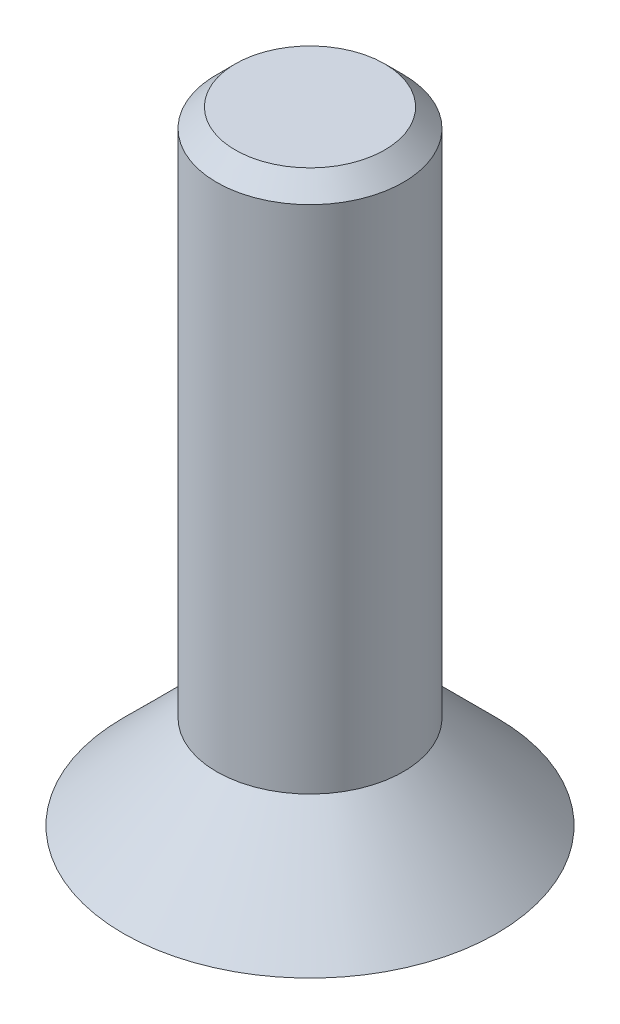
ISO-10303-21;
HEADER;
FILE_DESCRIPTION(('STEP AP214'),'2;1');
FILE_NAME('part.step','',(''),(''),'','','');
FILE_SCHEMA(('AUTOMOTIVE_DESIGN { 1 0 10303 214 1 1 1 1 }'));
ENDSEC;
DATA;
#1=APPLICATION_CONTEXT('core data for automotive mechanical design processes');
#2=APPLICATION_PROTOCOL_DEFINITION('international standard','automotive_design',2000,#1);
#3=PRODUCT_CONTEXT('',#1,'mechanical');
#4=PRODUCT('Part','Part','',(#3));
#5=PRODUCT_RELATED_PRODUCT_CATEGORY('part','',(#4));
#6=PRODUCT_DEFINITION_FORMATION('','',#4);
#7=PRODUCT_DEFINITION_CONTEXT('part definition',#1,'design');
#8=PRODUCT_DEFINITION('design','',#6,#7);
#9=PRODUCT_DEFINITION_SHAPE('','',#8);
#10=(LENGTH_UNIT() NAMED_UNIT(*) SI_UNIT(.MILLI.,.METRE.));
#11=(NAMED_UNIT(*) PLANE_ANGLE_UNIT() SI_UNIT($,.RADIAN.));
#12=(NAMED_UNIT(*) SI_UNIT($,.STERADIAN.) SOLID_ANGLE_UNIT());
#13=UNCERTAINTY_MEASURE_WITH_UNIT(LENGTH_MEASURE(1.E-05),#10,'distance_accuracy_value','');
#14=(GEOMETRIC_REPRESENTATION_CONTEXT(3) GLOBAL_UNCERTAINTY_ASSIGNED_CONTEXT((#13)) GLOBAL_UNIT_ASSIGNED_CONTEXT((#10,
#11,#12)) REPRESENTATION_CONTEXT('',''));
#15=CARTESIAN_POINT('',(0.,0.,0.));
#16=DIRECTION('',(0.,0.,1.));
#17=DIRECTION('',(1.,0.,0.));
#18=AXIS2_PLACEMENT_3D('',#15,#16,#17);
#19=CARTESIAN_POINT('',(0.,0.,0.));
#20=DIRECTION('',(0.,-1.,0.));
#21=DIRECTION('',(0.,0.,-1.));
#22=AXIS2_PLACEMENT_3D('',#19,#20,#21);
#23=PLANE('',#22);
#24=DIRECTION('',(0.5,0.,0.866025403784439));
#25=VECTOR('',#24,1.);
#26=CARTESIAN_POINT('',(0.577350269189626,0.,-1.));
#27=LINE('',#26,#25);
#28=CARTESIAN_POINT('',(0.577350269189626,0.,-1.));
#29=VERTEX_POINT('',#28);
#30=CARTESIAN_POINT('',(1.15470053837925,0.,0.));
#31=VERTEX_POINT('',#30);
#32=EDGE_CURVE('E58',#29,#31,#27,.T.);
#33=ORIENTED_EDGE('',*,*,#32,.F.);
#34=DIRECTION('',(1.,0.,0.));
#35=VECTOR('',#34,1.);
#36=CARTESIAN_POINT('',(-0.577350269189626,0.,-1.));
#37=LINE('',#36,#35);
#38=CARTESIAN_POINT('',(-0.577350269189626,0.,-1.));
#39=VERTEX_POINT('',#38);
#40=EDGE_CURVE('E153',#39,#29,#37,.T.);
#41=ORIENTED_EDGE('',*,*,#40,.F.);
#42=DIRECTION('',(0.5,0.,-0.866025403784439));
#43=VECTOR('',#42,1.);
#44=CARTESIAN_POINT('',(-1.15470053837925,0.,0.));
#45=LINE('',#44,#43);
#46=CARTESIAN_POINT('',(-1.15470053837925,0.,0.));
#47=VERTEX_POINT('',#46);
#48=EDGE_CURVE('E147',#47,#39,#45,.T.);
#49=ORIENTED_EDGE('',*,*,#48,.F.);
#50=DIRECTION('',(-0.5,0.,-0.866025403784439));
#51=VECTOR('',#50,1.);
#52=CARTESIAN_POINT('',(-0.577350269189626,0.,1.));
#53=LINE('',#52,#51);
#54=CARTESIAN_POINT('',(-0.577350269189626,0.,1.));
#55=VERTEX_POINT('',#54);
#56=EDGE_CURVE('E107',#55,#47,#53,.T.);
#57=ORIENTED_EDGE('',*,*,#56,.F.);
#58=DIRECTION('',(-1.,0.,0.));
#59=VECTOR('',#58,1.);
#60=CARTESIAN_POINT('',(0.577350269189626,0.,1.));
#61=LINE('',#60,#59);
#62=CARTESIAN_POINT('',(0.577350269189626,0.,1.));
#63=VERTEX_POINT('',#62);
#64=EDGE_CURVE('E145',#63,#55,#61,.T.);
#65=ORIENTED_EDGE('',*,*,#64,.F.);
#66=DIRECTION('',(-0.5,0.,0.866025403784439));
#67=VECTOR('',#66,1.);
#68=CARTESIAN_POINT('',(1.15470053837925,0.,0.));
#69=LINE('',#68,#67);
#70=EDGE_CURVE('E138',#31,#63,#69,.T.);
#71=ORIENTED_EDGE('',*,*,#70,.F.);
#72=EDGE_LOOP('',(#33,#41,#49,#57,#65,#71));
#73=FACE_BOUND('',#72,.T.);
#74=CARTESIAN_POINT('',(0.,0.,0.));
#75=DIRECTION('',(0.,-1.,0.));
#76=DIRECTION('',(0.,0.,-1.));
#77=AXIS2_PLACEMENT_3D('',#74,#75,#76);
#78=CIRCLE('',#77,3.);
#79=CARTESIAN_POINT('',(0.,0.,-3.));
#80=VERTEX_POINT('',#79);
#81=EDGE_CURVE('E11',#80,#80,#78,.T.);
#82=ORIENTED_EDGE('',*,*,#81,.T.);
#83=EDGE_LOOP('',(#82));
#84=FACE_BOUND('',#83,.T.);
#85=ADVANCED_FACE('F44',(#73,#84),#23,.T.);
#86=CARTESIAN_POINT('',(0.,0.,0.));
#87=DIRECTION('',(0.,-1.,0.));
#88=DIRECTION('',(0.,0.,-1.));
#89=AXIS2_PLACEMENT_3D('',#86,#87,#88);
#90=CONICAL_SURFACE('',#89,3.,0.785398163397448);
#91=CARTESIAN_POINT('',(0.,1.5,0.));
#92=DIRECTION('',(0.,-1.,0.));
#93=DIRECTION('',(0.,0.,-1.));
#94=AXIS2_PLACEMENT_3D('',#91,#92,#93);
#95=CIRCLE('',#94,1.5);
#96=CARTESIAN_POINT('',(0.,1.5,-1.5));
#97=VERTEX_POINT('',#96);
#98=EDGE_CURVE('E52',#97,#97,#95,.T.);
#99=ORIENTED_EDGE('',*,*,#98,.T.);
#100=EDGE_LOOP('',(#99));
#101=FACE_BOUND('',#100,.T.);
#102=ORIENTED_EDGE('',*,*,#81,.F.);
#103=EDGE_LOOP('',(#102));
#104=FACE_BOUND('',#103,.T.);
#105=ADVANCED_FACE('F176',(#101,#104),#90,.T.);
#106=CARTESIAN_POINT('',(0.,-2.,0.));
#107=DIRECTION('',(0.,-1.,0.));
#108=DIRECTION('',(0.,0.,-1.));
#109=AXIS2_PLACEMENT_3D('',#106,#107,#108);
#110=CYLINDRICAL_SURFACE('',#109,1.5);
#111=CARTESIAN_POINT('',(0.,9.7,0.));
#112=DIRECTION('',(0.,-1.,0.));
#113=DIRECTION('',(0.,0.,-1.));
#114=AXIS2_PLACEMENT_3D('',#111,#112,#113);
#115=CIRCLE('',#114,1.5);
#116=CARTESIAN_POINT('',(0.,9.7,-1.5));
#117=VERTEX_POINT('',#116);
#118=EDGE_CURVE('E174',#117,#117,#115,.T.);
#119=ORIENTED_EDGE('',*,*,#118,.T.);
#120=EDGE_LOOP('',(#119));
#121=FACE_BOUND('',#120,.T.);
#122=ORIENTED_EDGE('',*,*,#98,.F.);
#123=EDGE_LOOP('',(#122));
#124=FACE_BOUND('',#123,.T.);
#125=ADVANCED_FACE('F185',(#121,#124),#110,.T.);
#126=CARTESIAN_POINT('',(0.,9.7,0.));
#127=DIRECTION('',(0.,-1.,0.));
#128=DIRECTION('',(0.,0.,-1.));
#129=AXIS2_PLACEMENT_3D('',#126,#127,#128);
#130=CONICAL_SURFACE('',#129,1.5,0.785398163397446);
#131=CARTESIAN_POINT('',(0.,10.,0.));
#132=DIRECTION('',(0.,-1.,0.));
#133=DIRECTION('',(0.,0.,-1.));
#134=AXIS2_PLACEMENT_3D('',#131,#132,#133);
#135=CIRCLE('',#134,1.2);
#136=CARTESIAN_POINT('',(0.,10.,-1.2));
#137=VERTEX_POINT('',#136);
#138=EDGE_CURVE('E157',#137,#137,#135,.T.);
#139=ORIENTED_EDGE('',*,*,#138,.T.);
#140=EDGE_LOOP('',(#139));
#141=FACE_BOUND('',#140,.T.);
#142=ORIENTED_EDGE('',*,*,#118,.F.);
#143=EDGE_LOOP('',(#142));
#144=FACE_BOUND('',#143,.T.);
#145=ADVANCED_FACE('F184',(#141,#144),#130,.T.);
#146=CARTESIAN_POINT('',(1.2,10.,0.));
#147=DIRECTION('',(0.,1.,0.));
#148=DIRECTION('',(0.,0.,1.));
#149=AXIS2_PLACEMENT_3D('',#146,#147,#148);
#150=PLANE('',#149);
#151=ORIENTED_EDGE('',*,*,#138,.F.);
#152=EDGE_LOOP('',(#151));
#153=FACE_BOUND('',#152,.T.);
#154=ADVANCED_FACE('F192',(#153),#150,.T.);
#155=CARTESIAN_POINT('',(0.577350269189626,1.1,-1.));
#156=DIRECTION('',(0.866025403784439,0.,-0.5));
#157=DIRECTION('',(-0.5,0.,-0.866025403784439));
#158=AXIS2_PLACEMENT_3D('',#155,#156,#157);
#159=PLANE('',#158);
#160=ORIENTED_EDGE('',*,*,#32,.T.);
#161=DIRECTION('',(0.,-1.,0.));
#162=VECTOR('',#161,1.);
#163=CARTESIAN_POINT('',(1.15470053837925,1.1,0.));
#164=LINE('',#163,#162);
#165=CARTESIAN_POINT('',(1.15470053837925,1.1,0.));
#166=VERTEX_POINT('',#165);
#167=EDGE_CURVE('E89',#166,#31,#164,.T.);
#168=ORIENTED_EDGE('',*,*,#167,.F.);
#169=DIRECTION('',(0.5,0.,0.866025403784439));
#170=VECTOR('',#169,1.);
#171=CARTESIAN_POINT('',(0.577350269189626,1.1,-1.));
#172=LINE('',#171,#170);
#173=CARTESIAN_POINT('',(0.577350269189626,1.1,-1.));
#174=VERTEX_POINT('',#173);
#175=EDGE_CURVE('E156',#174,#166,#172,.T.);
#176=ORIENTED_EDGE('',*,*,#175,.F.);
#177=DIRECTION('',(0.,-1.,0.));
#178=VECTOR('',#177,1.);
#179=CARTESIAN_POINT('',(0.577350269189626,1.1,-1.));
#180=LINE('',#179,#178);
#181=EDGE_CURVE('E70',#174,#29,#180,.T.);
#182=ORIENTED_EDGE('',*,*,#181,.T.);
#183=EDGE_LOOP('',(#160,#168,#176,#182));
#184=FACE_BOUND('',#183,.T.);
#185=ADVANCED_FACE('F209',(#184),#159,.F.);
#186=CARTESIAN_POINT('',(-0.577350269189626,1.1,-1.));
#187=DIRECTION('',(0.,0.,-1.));
#188=DIRECTION('',(-1.,0.,0.));
#189=AXIS2_PLACEMENT_3D('',#186,#187,#188);
#190=PLANE('',#189);
#191=ORIENTED_EDGE('',*,*,#40,.T.);
#192=ORIENTED_EDGE('',*,*,#181,.F.);
#193=DIRECTION('',(1.,0.,0.));
#194=VECTOR('',#193,1.);
#195=CARTESIAN_POINT('',(-0.577350269189626,1.1,-1.));
#196=LINE('',#195,#194);
#197=CARTESIAN_POINT('',(-0.577350269189626,1.1,-1.));
#198=VERTEX_POINT('',#197);
#199=EDGE_CURVE('E124',#198,#174,#196,.T.);
#200=ORIENTED_EDGE('',*,*,#199,.F.);
#201=DIRECTION('',(0.,-1.,0.));
#202=VECTOR('',#201,1.);
#203=CARTESIAN_POINT('',(-0.577350269189626,1.1,-1.));
#204=LINE('',#203,#202);
#205=EDGE_CURVE('E114',#198,#39,#204,.T.);
#206=ORIENTED_EDGE('',*,*,#205,.T.);
#207=EDGE_LOOP('',(#191,#192,#200,#206));
#208=FACE_BOUND('',#207,.T.);
#209=ADVANCED_FACE('F211',(#208),#190,.F.);
#210=CARTESIAN_POINT('',(-1.15470053837925,1.1,0.));
#211=DIRECTION('',(-0.866025403784439,0.,-0.5));
#212=DIRECTION('',(-0.5,0.,0.866025403784439));
#213=AXIS2_PLACEMENT_3D('',#210,#211,#212);
#214=PLANE('',#213);
#215=ORIENTED_EDGE('',*,*,#48,.T.);
#216=ORIENTED_EDGE('',*,*,#205,.F.);
#217=DIRECTION('',(0.5,0.,-0.866025403784439));
#218=VECTOR('',#217,1.);
#219=CARTESIAN_POINT('',(-1.15470053837925,1.1,0.));
#220=LINE('',#219,#218);
#221=CARTESIAN_POINT('',(-1.15470053837925,1.1,0.));
#222=VERTEX_POINT('',#221);
#223=EDGE_CURVE('E119',#222,#198,#220,.T.);
#224=ORIENTED_EDGE('',*,*,#223,.F.);
#225=DIRECTION('',(0.,-1.,0.));
#226=VECTOR('',#225,1.);
#227=CARTESIAN_POINT('',(-1.15470053837925,1.1,0.));
#228=LINE('',#227,#226);
#229=EDGE_CURVE('E101',#222,#47,#228,.T.);
#230=ORIENTED_EDGE('',*,*,#229,.T.);
#231=EDGE_LOOP('',(#215,#216,#224,#230));
#232=FACE_BOUND('',#231,.T.);
#233=ADVANCED_FACE('F117',(#232),#214,.F.);
#234=CARTESIAN_POINT('',(-0.577350269189626,1.1,1.));
#235=DIRECTION('',(-0.866025403784438,0.,0.5));
#236=DIRECTION('',(0.5,0.,0.866025403784439));
#237=AXIS2_PLACEMENT_3D('',#234,#235,#236);
#238=PLANE('',#237);
#239=ORIENTED_EDGE('',*,*,#56,.T.);
#240=ORIENTED_EDGE('',*,*,#229,.F.);
#241=DIRECTION('',(-0.5,0.,-0.866025403784439));
#242=VECTOR('',#241,1.);
#243=CARTESIAN_POINT('',(-0.577350269189626,1.1,1.));
#244=LINE('',#243,#242);
#245=CARTESIAN_POINT('',(-0.577350269189626,1.1,1.));
#246=VERTEX_POINT('',#245);
#247=EDGE_CURVE('E104',#246,#222,#244,.T.);
#248=ORIENTED_EDGE('',*,*,#247,.F.);
#249=DIRECTION('',(0.,-1.,0.));
#250=VECTOR('',#249,1.);
#251=CARTESIAN_POINT('',(-0.577350269189626,1.1,1.));
#252=LINE('',#251,#250);
#253=EDGE_CURVE('E111',#246,#55,#252,.T.);
#254=ORIENTED_EDGE('',*,*,#253,.T.);
#255=EDGE_LOOP('',(#239,#240,#248,#254));
#256=FACE_BOUND('',#255,.T.);
#257=ADVANCED_FACE('F103',(#256),#238,.F.);
#258=CARTESIAN_POINT('',(0.577350269189626,1.1,1.));
#259=DIRECTION('',(0.,0.,1.));
#260=DIRECTION('',(1.,0.,0.));
#261=AXIS2_PLACEMENT_3D('',#258,#259,#260);
#262=PLANE('',#261);
#263=ORIENTED_EDGE('',*,*,#64,.T.);
#264=ORIENTED_EDGE('',*,*,#253,.F.);
#265=DIRECTION('',(-1.,0.,0.));
#266=VECTOR('',#265,1.);
#267=CARTESIAN_POINT('',(0.577350269189626,1.1,1.));
#268=LINE('',#267,#266);
#269=CARTESIAN_POINT('',(0.577350269189626,1.1,1.));
#270=VERTEX_POINT('',#269);
#271=EDGE_CURVE('E126',#270,#246,#268,.T.);
#272=ORIENTED_EDGE('',*,*,#271,.F.);
#273=DIRECTION('',(0.,-1.,0.));
#274=VECTOR('',#273,1.);
#275=CARTESIAN_POINT('',(0.577350269189626,1.1,1.));
#276=LINE('',#275,#274);
#277=EDGE_CURVE('E163',#270,#63,#276,.T.);
#278=ORIENTED_EDGE('',*,*,#277,.T.);
#279=EDGE_LOOP('',(#263,#264,#272,#278));
#280=FACE_BOUND('',#279,.T.);
#281=ADVANCED_FACE('F225',(#280),#262,.F.);
#282=CARTESIAN_POINT('',(1.15470053837925,1.1,0.));
#283=DIRECTION('',(0.866025403784439,0.,0.5));
#284=DIRECTION('',(0.5,0.,-0.866025403784439));
#285=AXIS2_PLACEMENT_3D('',#282,#283,#284);
#286=PLANE('',#285);
#287=ORIENTED_EDGE('',*,*,#70,.T.);
#288=ORIENTED_EDGE('',*,*,#277,.F.);
#289=DIRECTION('',(-0.5,0.,0.866025403784439));
#290=VECTOR('',#289,1.);
#291=CARTESIAN_POINT('',(1.15470053837925,1.1,0.));
#292=LINE('',#291,#290);
#293=EDGE_CURVE('E134',#166,#270,#292,.T.);
#294=ORIENTED_EDGE('',*,*,#293,.F.);
#295=ORIENTED_EDGE('',*,*,#167,.T.);
#296=EDGE_LOOP('',(#287,#288,#294,#295));
#297=FACE_BOUND('',#296,.T.);
#298=ADVANCED_FACE('F206',(#297),#286,.F.);
#299=CARTESIAN_POINT('',(0.,1.1,0.));
#300=DIRECTION('',(0.,-1.,0.));
#301=DIRECTION('',(0.,0.,-1.));
#302=AXIS2_PLACEMENT_3D('',#299,#300,#301);
#303=PLANE('',#302);
#304=ORIENTED_EDGE('',*,*,#175,.T.);
#305=ORIENTED_EDGE('',*,*,#293,.T.);
#306=ORIENTED_EDGE('',*,*,#271,.T.);
#307=ORIENTED_EDGE('',*,*,#247,.T.);
#308=ORIENTED_EDGE('',*,*,#223,.T.);
#309=ORIENTED_EDGE('',*,*,#199,.T.);
#310=EDGE_LOOP('',(#304,#305,#306,#307,#308,#309));
#311=FACE_BOUND('',#310,.T.);
#312=ADVANCED_FACE('F123',(#311),#303,.T.);
#313=CLOSED_SHELL('',(#85,#105,#125,#145,#154,#185,#209,#233,#257,#281,#298,#312));
#314=MANIFOLD_SOLID_BREP('B2',#313);
#315=ADVANCED_BREP_SHAPE_REPRESENTATION('',(#18,#314),#14);
#316=SHAPE_DEFINITION_REPRESENTATION(#9,#315);
ENDSEC;
END-ISO-10303-21;
